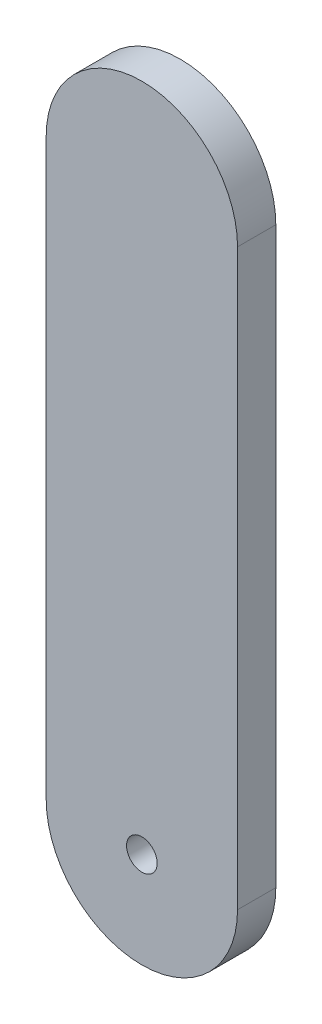
ISO-10303-21;
HEADER;
FILE_DESCRIPTION(('STEP AP214'),'2;1');
FILE_NAME('part.step','',(''),(''),'','','');
FILE_SCHEMA(('AUTOMOTIVE_DESIGN { 1 0 10303 214 1 1 1 1 }'));
ENDSEC;
DATA;
#1=APPLICATION_CONTEXT('core data for automotive mechanical design processes');
#2=APPLICATION_PROTOCOL_DEFINITION('international standard','automotive_design',2000,#1);
#3=PRODUCT_CONTEXT('',#1,'mechanical');
#4=PRODUCT('Part','Part','',(#3));
#5=PRODUCT_RELATED_PRODUCT_CATEGORY('part','',(#4));
#6=PRODUCT_DEFINITION_FORMATION('','',#4);
#7=PRODUCT_DEFINITION_CONTEXT('part definition',#1,'design');
#8=PRODUCT_DEFINITION('design','',#6,#7);
#9=PRODUCT_DEFINITION_SHAPE('','',#8);
#10=(LENGTH_UNIT() NAMED_UNIT(*) SI_UNIT(.MILLI.,.METRE.));
#11=(NAMED_UNIT(*) PLANE_ANGLE_UNIT() SI_UNIT($,.RADIAN.));
#12=(NAMED_UNIT(*) SI_UNIT($,.STERADIAN.) SOLID_ANGLE_UNIT());
#13=UNCERTAINTY_MEASURE_WITH_UNIT(LENGTH_MEASURE(1.E-05),#10,'distance_accuracy_value','');
#14=(GEOMETRIC_REPRESENTATION_CONTEXT(3) GLOBAL_UNCERTAINTY_ASSIGNED_CONTEXT((#13)) GLOBAL_UNIT_ASSIGNED_CONTEXT((#10,
#11,#12)) REPRESENTATION_CONTEXT('',''));
#15=CARTESIAN_POINT('',(0.,0.,0.));
#16=DIRECTION('',(0.,0.,1.));
#17=DIRECTION('',(1.,0.,0.));
#18=AXIS2_PLACEMENT_3D('',#15,#16,#17);
#19=CARTESIAN_POINT('',(0.,150.,10.));
#20=DIRECTION('',(0.,0.,-1.));
#21=DIRECTION('',(-1.,0.,0.));
#22=AXIS2_PLACEMENT_3D('',#19,#20,#21);
#23=CYLINDRICAL_SURFACE('',#22,25.);
#24=CARTESIAN_POINT('',(0.,150.,0.));
#25=DIRECTION('',(0.,0.,1.));
#26=DIRECTION('',(1.,0.,0.));
#27=AXIS2_PLACEMENT_3D('',#24,#25,#26);
#28=CIRCLE('',#27,25.);
#29=CARTESIAN_POINT('',(25.,150.,0.));
#30=VERTEX_POINT('',#29);
#31=CARTESIAN_POINT('',(-25.,150.,0.));
#32=VERTEX_POINT('',#31);
#33=EDGE_CURVE('E107',#30,#32,#28,.T.);
#34=ORIENTED_EDGE('',*,*,#33,.T.);
#35=DIRECTION('',(0.,0.,-1.));
#36=VECTOR('',#35,1.);
#37=CARTESIAN_POINT('',(-25.,150.,10.));
#38=LINE('',#37,#36);
#39=CARTESIAN_POINT('',(-25.,150.,10.));
#40=VERTEX_POINT('',#39);
#41=EDGE_CURVE('E11',#40,#32,#38,.T.);
#42=ORIENTED_EDGE('',*,*,#41,.F.);
#43=CARTESIAN_POINT('',(0.,150.,10.));
#44=DIRECTION('',(0.,0.,1.));
#45=DIRECTION('',(1.,0.,0.));
#46=AXIS2_PLACEMENT_3D('',#43,#44,#45);
#47=CIRCLE('',#46,25.);
#48=CARTESIAN_POINT('',(25.,150.,10.));
#49=VERTEX_POINT('',#48);
#50=EDGE_CURVE('E91',#49,#40,#47,.T.);
#51=ORIENTED_EDGE('',*,*,#50,.F.);
#52=DIRECTION('',(0.,0.,-1.));
#53=VECTOR('',#52,1.);
#54=CARTESIAN_POINT('',(25.,150.,10.));
#55=LINE('',#54,#53);
#56=EDGE_CURVE('E103',#49,#30,#55,.T.);
#57=ORIENTED_EDGE('',*,*,#56,.T.);
#58=EDGE_LOOP('',(#34,#42,#51,#57));
#59=FACE_BOUND('',#58,.T.);
#60=ADVANCED_FACE('F39',(#59),#23,.T.);
#61=CARTESIAN_POINT('',(-24.9999999999999,0.,10.));
#62=DIRECTION('',(1.,0.,0.));
#63=DIRECTION('',(0.,1.,0.));
#64=AXIS2_PLACEMENT_3D('',#61,#62,#63);
#65=PLANE('',#64);
#66=DIRECTION('',(0.,-1.,0.));
#67=VECTOR('',#66,1.);
#68=CARTESIAN_POINT('',(-24.9999999999999,0.,0.));
#69=LINE('',#68,#67);
#70=CARTESIAN_POINT('',(-24.9999999999999,0.,0.));
#71=VERTEX_POINT('',#70);
#72=EDGE_CURVE('E96',#32,#71,#69,.T.);
#73=ORIENTED_EDGE('',*,*,#72,.T.);
#74=DIRECTION('',(0.,0.,-1.));
#75=VECTOR('',#74,1.);
#76=CARTESIAN_POINT('',(-24.9999999999999,0.,10.));
#77=LINE('',#76,#75);
#78=CARTESIAN_POINT('',(-24.9999999999999,0.,10.));
#79=VERTEX_POINT('',#78);
#80=EDGE_CURVE('E48',#79,#71,#77,.T.);
#81=ORIENTED_EDGE('',*,*,#80,.F.);
#82=DIRECTION('',(0.,-1.,0.));
#83=VECTOR('',#82,1.);
#84=CARTESIAN_POINT('',(-24.9999999999999,0.,10.));
#85=LINE('',#84,#83);
#86=EDGE_CURVE('E86',#40,#79,#85,.T.);
#87=ORIENTED_EDGE('',*,*,#86,.F.);
#88=ORIENTED_EDGE('',*,*,#41,.T.);
#89=EDGE_LOOP('',(#73,#81,#87,#88));
#90=FACE_BOUND('',#89,.T.);
#91=ADVANCED_FACE('F95',(#90),#65,.F.);
#92=CARTESIAN_POINT('',(0.,0.,10.));
#93=DIRECTION('',(0.,0.,-1.));
#94=DIRECTION('',(-1.,0.,0.));
#95=AXIS2_PLACEMENT_3D('',#92,#93,#94);
#96=CYLINDRICAL_SURFACE('',#95,25.0000000000001);
#97=CARTESIAN_POINT('',(0.,0.,0.));
#98=DIRECTION('',(0.,0.,1.));
#99=DIRECTION('',(1.,0.,0.));
#100=AXIS2_PLACEMENT_3D('',#97,#98,#99);
#101=CIRCLE('',#100,25.0000000000001);
#102=CARTESIAN_POINT('',(25.0000000000001,0.,0.));
#103=VERTEX_POINT('',#102);
#104=EDGE_CURVE('E73',#71,#103,#101,.T.);
#105=ORIENTED_EDGE('',*,*,#104,.T.);
#106=DIRECTION('',(0.,0.,-1.));
#107=VECTOR('',#106,1.);
#108=CARTESIAN_POINT('',(25.0000000000001,0.,10.));
#109=LINE('',#108,#107);
#110=CARTESIAN_POINT('',(25.0000000000001,0.,10.));
#111=VERTEX_POINT('',#110);
#112=EDGE_CURVE('E98',#111,#103,#109,.T.);
#113=ORIENTED_EDGE('',*,*,#112,.F.);
#114=CARTESIAN_POINT('',(0.,0.,10.));
#115=DIRECTION('',(0.,0.,1.));
#116=DIRECTION('',(1.,0.,0.));
#117=AXIS2_PLACEMENT_3D('',#114,#115,#116);
#118=CIRCLE('',#117,25.0000000000001);
#119=EDGE_CURVE('E89',#79,#111,#118,.T.);
#120=ORIENTED_EDGE('',*,*,#119,.F.);
#121=ORIENTED_EDGE('',*,*,#80,.T.);
#122=EDGE_LOOP('',(#105,#113,#120,#121));
#123=FACE_BOUND('',#122,.T.);
#124=ADVANCED_FACE('F99',(#123),#96,.T.);
#125=CARTESIAN_POINT('',(25.0000000000003,0.,10.));
#126=DIRECTION('',(-1.,0.,0.));
#127=DIRECTION('',(0.,-1.,0.));
#128=AXIS2_PLACEMENT_3D('',#125,#126,#127);
#129=PLANE('',#128);
#130=DIRECTION('',(0.,1.,0.));
#131=VECTOR('',#130,1.);
#132=CARTESIAN_POINT('',(25.0000000000003,0.,0.));
#133=LINE('',#132,#131);
#134=EDGE_CURVE('E79',#103,#30,#133,.T.);
#135=ORIENTED_EDGE('',*,*,#134,.T.);
#136=ORIENTED_EDGE('',*,*,#56,.F.);
#137=DIRECTION('',(0.,1.,0.));
#138=VECTOR('',#137,1.);
#139=CARTESIAN_POINT('',(25.0000000000003,0.,10.));
#140=LINE('',#139,#138);
#141=EDGE_CURVE('E56',#111,#49,#140,.T.);
#142=ORIENTED_EDGE('',*,*,#141,.F.);
#143=ORIENTED_EDGE('',*,*,#112,.T.);
#144=EDGE_LOOP('',(#135,#136,#142,#143));
#145=FACE_BOUND('',#144,.T.);
#146=ADVANCED_FACE('F121',(#145),#129,.F.);
#147=CARTESIAN_POINT('',(0.,150.,10.));
#148=DIRECTION('',(0.,0.,1.));
#149=DIRECTION('',(1.,0.,0.));
#150=AXIS2_PLACEMENT_3D('',#147,#148,#149);
#151=PLANE('',#150);
#152=CARTESIAN_POINT('',(0.,0.,10.));
#153=DIRECTION('',(0.,0.,-1.));
#154=DIRECTION('',(-1.,0.,0.));
#155=AXIS2_PLACEMENT_3D('',#152,#153,#154);
#156=CIRCLE('',#155,4.);
#157=CARTESIAN_POINT('',(-4.,0.,10.));
#158=VERTEX_POINT('',#157);
#159=EDGE_CURVE('E111',#158,#158,#156,.T.);
#160=ORIENTED_EDGE('',*,*,#159,.T.);
#161=EDGE_LOOP('',(#160));
#162=FACE_BOUND('',#161,.T.);
#163=ORIENTED_EDGE('',*,*,#50,.T.);
#164=ORIENTED_EDGE('',*,*,#86,.T.);
#165=ORIENTED_EDGE('',*,*,#119,.T.);
#166=ORIENTED_EDGE('',*,*,#141,.T.);
#167=EDGE_LOOP('',(#163,#164,#165,#166));
#168=FACE_BOUND('',#167,.T.);
#169=ADVANCED_FACE('F87',(#162,#168),#151,.T.);
#170=CARTESIAN_POINT('',(0.,150.,0.));
#171=DIRECTION('',(0.,0.,1.));
#172=DIRECTION('',(1.,0.,0.));
#173=AXIS2_PLACEMENT_3D('',#170,#171,#172);
#174=PLANE('',#173);
#175=CARTESIAN_POINT('',(0.,0.,0.));
#176=DIRECTION('',(0.,0.,-1.));
#177=DIRECTION('',(-1.,0.,0.));
#178=AXIS2_PLACEMENT_3D('',#175,#176,#177);
#179=CIRCLE('',#178,4.);
#180=CARTESIAN_POINT('',(-4.,0.,0.));
#181=VERTEX_POINT('',#180);
#182=EDGE_CURVE('E128',#181,#181,#179,.T.);
#183=ORIENTED_EDGE('',*,*,#182,.F.);
#184=EDGE_LOOP('',(#183));
#185=FACE_BOUND('',#184,.T.);
#186=ORIENTED_EDGE('',*,*,#33,.F.);
#187=ORIENTED_EDGE('',*,*,#134,.F.);
#188=ORIENTED_EDGE('',*,*,#104,.F.);
#189=ORIENTED_EDGE('',*,*,#72,.F.);
#190=EDGE_LOOP('',(#186,#187,#188,#189));
#191=FACE_BOUND('',#190,.T.);
#192=ADVANCED_FACE('F124',(#185,#191),#174,.F.);
#193=CARTESIAN_POINT('',(0.,0.,10.));
#194=DIRECTION('',(0.,0.,-1.));
#195=DIRECTION('',(-1.,0.,0.));
#196=AXIS2_PLACEMENT_3D('',#193,#194,#195);
#197=CYLINDRICAL_SURFACE('',#196,4.);
#198=ORIENTED_EDGE('',*,*,#159,.F.);
#199=EDGE_LOOP('',(#198));
#200=FACE_BOUND('',#199,.T.);
#201=ORIENTED_EDGE('',*,*,#182,.T.);
#202=EDGE_LOOP('',(#201));
#203=FACE_BOUND('',#202,.T.);
#204=ADVANCED_FACE('F137',(#200,#203),#197,.F.);
#205=CLOSED_SHELL('',(#60,#91,#124,#146,#169,#192,#204));
#206=MANIFOLD_SOLID_BREP('B2',#205);
#207=ADVANCED_BREP_SHAPE_REPRESENTATION('',(#18,#206),#14);
#208=SHAPE_DEFINITION_REPRESENTATION(#9,#207);
ENDSEC;
END-ISO-10303-21;
